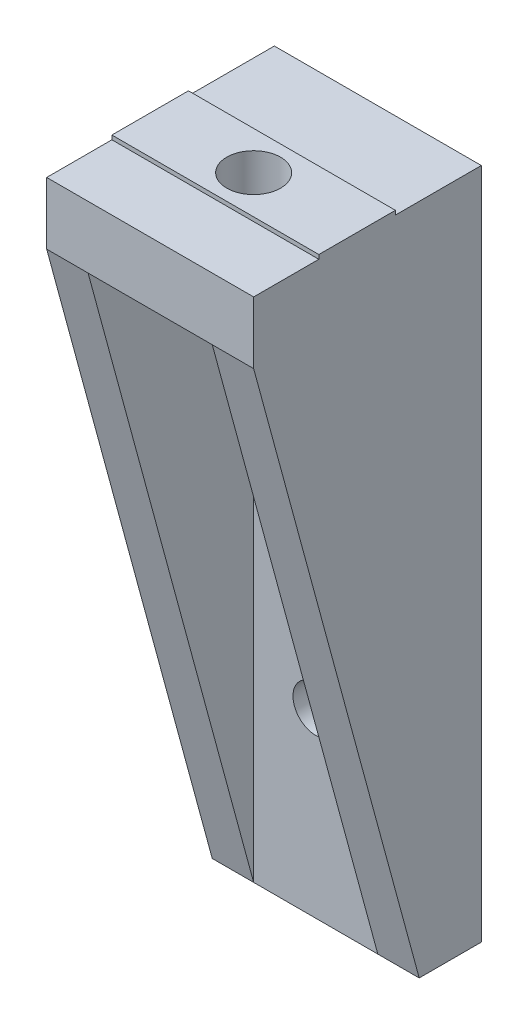
ISO-10303-21;
HEADER;
FILE_DESCRIPTION(('STEP AP214'),'2;1');
FILE_NAME('part.step','',(''),(''),'','','');
FILE_SCHEMA(('AUTOMOTIVE_DESIGN { 1 0 10303 214 1 1 1 1 }'));
ENDSEC;
DATA;
#1=APPLICATION_CONTEXT('core data for automotive mechanical design processes');
#2=APPLICATION_PROTOCOL_DEFINITION('international standard','automotive_design',2000,#1);
#3=PRODUCT_CONTEXT('',#1,'mechanical');
#4=PRODUCT('Part','Part','',(#3));
#5=PRODUCT_RELATED_PRODUCT_CATEGORY('part','',(#4));
#6=PRODUCT_DEFINITION_FORMATION('','',#4);
#7=PRODUCT_DEFINITION_CONTEXT('part definition',#1,'design');
#8=PRODUCT_DEFINITION('design','',#6,#7);
#9=PRODUCT_DEFINITION_SHAPE('','',#8);
#10=(LENGTH_UNIT() NAMED_UNIT(*) SI_UNIT(.MILLI.,.METRE.));
#11=(NAMED_UNIT(*) PLANE_ANGLE_UNIT() SI_UNIT($,.RADIAN.));
#12=(NAMED_UNIT(*) SI_UNIT($,.STERADIAN.) SOLID_ANGLE_UNIT());
#13=UNCERTAINTY_MEASURE_WITH_UNIT(LENGTH_MEASURE(1.E-05),#10,'distance_accuracy_value','');
#14=(GEOMETRIC_REPRESENTATION_CONTEXT(3) GLOBAL_UNCERTAINTY_ASSIGNED_CONTEXT((#13)) GLOBAL_UNIT_ASSIGNED_CONTEXT((#10,
#11,#12)) REPRESENTATION_CONTEXT('',''));
#15=CARTESIAN_POINT('',(0.,0.,0.));
#16=DIRECTION('',(0.,0.,1.));
#17=DIRECTION('',(1.,0.,0.));
#18=AXIS2_PLACEMENT_3D('',#15,#16,#17);
#19=CARTESIAN_POINT('',(0.,0.,6.));
#20=DIRECTION('',(0.,0.,1.));
#21=DIRECTION('',(1.,0.,0.));
#22=AXIS2_PLACEMENT_3D('',#19,#20,#21);
#23=PLANE('',#22);
#24=CARTESIAN_POINT('',(0.,17.5,6.));
#25=DIRECTION('',(0.,0.,-1.));
#26=DIRECTION('',(-1.,0.,0.));
#27=AXIS2_PLACEMENT_3D('',#24,#25,#26);
#28=CIRCLE('',#27,2.2);
#29=CARTESIAN_POINT('',(-2.2,17.5,6.));
#30=VERTEX_POINT('',#29);
#31=EDGE_CURVE('E168',#30,#30,#28,.T.);
#32=ORIENTED_EDGE('',*,*,#31,.T.);
#33=EDGE_LOOP('',(#32));
#34=FACE_BOUND('',#33,.T.);
#35=DIRECTION('',(1.,0.,0.));
#36=VECTOR('',#35,1.);
#37=CARTESIAN_POINT('',(10.,0.,6.));
#38=LINE('',#37,#36);
#39=CARTESIAN_POINT('',(-6.,0.,6.));
#40=VERTEX_POINT('',#39);
#41=CARTESIAN_POINT('',(6.,0.,6.));
#42=VERTEX_POINT('',#41);
#43=EDGE_CURVE('E151',#40,#42,#38,.T.);
#44=ORIENTED_EDGE('',*,*,#43,.T.);
#45=DIRECTION('',(0.,-1.,0.));
#46=VECTOR('',#45,1.);
#47=CARTESIAN_POINT('',(6.00000000000003,59.,6.));
#48=LINE('',#47,#46);
#49=CARTESIAN_POINT('',(6.00000000000003,59.,6.));
#50=VERTEX_POINT('',#49);
#51=EDGE_CURVE('E126',#50,#42,#48,.T.);
#52=ORIENTED_EDGE('',*,*,#51,.F.);
#53=DIRECTION('',(-1.,0.,0.));
#54=VECTOR('',#53,1.);
#55=CARTESIAN_POINT('',(10.,59.,6.));
#56=LINE('',#55,#54);
#57=CARTESIAN_POINT('',(-6.00000000000003,59.,6.));
#58=VERTEX_POINT('',#57);
#59=EDGE_CURVE('E158',#50,#58,#56,.T.);
#60=ORIENTED_EDGE('',*,*,#59,.T.);
#61=DIRECTION('',(0.,-1.,0.));
#62=VECTOR('',#61,1.);
#63=CARTESIAN_POINT('',(-6.00000000000003,59.,6.));
#64=LINE('',#63,#62);
#65=EDGE_CURVE('E155',#58,#40,#64,.T.);
#66=ORIENTED_EDGE('',*,*,#65,.T.);
#67=EDGE_LOOP('',(#44,#52,#60,#66));
#68=FACE_BOUND('',#67,.T.);
#69=ADVANCED_FACE('F36',(#34,#68),#23,.T.);
#70=CARTESIAN_POINT('',(0.,59.,0.));
#71=DIRECTION('',(0.,1.,0.));
#72=DIRECTION('',(0.,0.,1.));
#73=AXIS2_PLACEMENT_3D('',#70,#71,#72);
#74=PLANE('',#73);
#75=CARTESIAN_POINT('',(0.,59.,12.));
#76=DIRECTION('',(0.,1.,0.));
#77=DIRECTION('',(0.,0.,1.));
#78=AXIS2_PLACEMENT_3D('',#75,#76,#77);
#79=CIRCLE('',#78,2.6);
#80=CARTESIAN_POINT('',(0.,59.,14.6));
#81=VERTEX_POINT('',#80);
#82=EDGE_CURVE('E199',#81,#81,#79,.T.);
#83=ORIENTED_EDGE('',*,*,#82,.T.);
#84=EDGE_LOOP('',(#83));
#85=FACE_BOUND('',#84,.T.);
#86=DIRECTION('',(0.,0.,-1.));
#87=VECTOR('',#86,1.);
#88=CARTESIAN_POINT('',(6.00000000000003,59.,22.));
#89=LINE('',#88,#87);
#90=CARTESIAN_POINT('',(6.00000000000003,59.,22.));
#91=VERTEX_POINT('',#90);
#92=EDGE_CURVE('E132',#91,#50,#89,.T.);
#93=ORIENTED_EDGE('',*,*,#92,.F.);
#94=DIRECTION('',(1.,0.,0.));
#95=VECTOR('',#94,1.);
#96=CARTESIAN_POINT('',(-10.,59.,22.));
#97=LINE('',#96,#95);
#98=CARTESIAN_POINT('',(-6.00000000000003,59.,22.));
#99=VERTEX_POINT('',#98);
#100=EDGE_CURVE('E220',#99,#91,#97,.T.);
#101=ORIENTED_EDGE('',*,*,#100,.F.);
#102=DIRECTION('',(0.,0.,-1.));
#103=VECTOR('',#102,1.);
#104=CARTESIAN_POINT('',(-6.00000000000003,59.,22.));
#105=LINE('',#104,#103);
#106=EDGE_CURVE('E191',#99,#58,#105,.T.);
#107=ORIENTED_EDGE('',*,*,#106,.T.);
#108=ORIENTED_EDGE('',*,*,#59,.F.);
#109=EDGE_LOOP('',(#93,#101,#107,#108));
#110=FACE_BOUND('',#109,.T.);
#111=ADVANCED_FACE('F264',(#85,#110),#74,.F.);
#112=CARTESIAN_POINT('',(0.,65.,0.));
#113=DIRECTION('',(0.,1.,0.));
#114=DIRECTION('',(0.,0.,1.));
#115=AXIS2_PLACEMENT_3D('',#112,#113,#114);
#116=PLANE('',#115);
#117=DIRECTION('',(0.,0.,1.));
#118=VECTOR('',#117,1.);
#119=CARTESIAN_POINT('',(-10.,65.,0.));
#120=LINE('',#119,#118);
#121=CARTESIAN_POINT('',(-10.,65.,0.));
#122=VERTEX_POINT('',#121);
#123=CARTESIAN_POINT('',(-10.,65.,8.29999999999999));
#124=VERTEX_POINT('',#123);
#125=EDGE_CURVE('E226',#122,#124,#120,.T.);
#126=ORIENTED_EDGE('',*,*,#125,.T.);
#127=DIRECTION('',(1.,0.,0.));
#128=VECTOR('',#127,1.);
#129=CARTESIAN_POINT('',(-10.,65.,8.29999999999999));
#130=LINE('',#129,#128);
#131=CARTESIAN_POINT('',(10.,65.,8.29999999999999));
#132=VERTEX_POINT('',#131);
#133=EDGE_CURVE('E202',#124,#132,#130,.T.);
#134=ORIENTED_EDGE('',*,*,#133,.T.);
#135=DIRECTION('',(0.,0.,-1.));
#136=VECTOR('',#135,1.);
#137=CARTESIAN_POINT('',(9.99999999999999,65.,0.));
#138=LINE('',#137,#136);
#139=CARTESIAN_POINT('',(9.99999999999999,65.,0.));
#140=VERTEX_POINT('',#139);
#141=EDGE_CURVE('E232',#132,#140,#138,.T.);
#142=ORIENTED_EDGE('',*,*,#141,.T.);
#143=DIRECTION('',(-1.,0.,0.));
#144=VECTOR('',#143,1.);
#145=CARTESIAN_POINT('',(-10.,65.,0.));
#146=LINE('',#145,#144);
#147=EDGE_CURVE('E175',#140,#122,#146,.T.);
#148=ORIENTED_EDGE('',*,*,#147,.T.);
#149=EDGE_LOOP('',(#126,#134,#142,#148));
#150=FACE_BOUND('',#149,.T.);
#151=ADVANCED_FACE('F268',(#150),#116,.T.);
#152=CARTESIAN_POINT('',(10.,65.,22.));
#153=VERTEX_POINT('',#152);
#154=CARTESIAN_POINT('',(10.,65.,15.7));
#155=VERTEX_POINT('',#154);
#156=EDGE_CURVE('E233',#153,#155,#138,.T.);
#157=ORIENTED_EDGE('',*,*,#156,.T.);
#158=DIRECTION('',(-1.,0.,0.));
#159=VECTOR('',#158,1.);
#160=CARTESIAN_POINT('',(-10.,65.,15.7));
#161=LINE('',#160,#159);
#162=CARTESIAN_POINT('',(-10.,65.,15.7));
#163=VERTEX_POINT('',#162);
#164=EDGE_CURVE('E207',#155,#163,#161,.T.);
#165=ORIENTED_EDGE('',*,*,#164,.T.);
#166=CARTESIAN_POINT('',(-10.,65.,22.));
#167=VERTEX_POINT('',#166);
#168=EDGE_CURVE('E230',#163,#167,#120,.T.);
#169=ORIENTED_EDGE('',*,*,#168,.T.);
#170=DIRECTION('',(1.,0.,0.));
#171=VECTOR('',#170,1.);
#172=CARTESIAN_POINT('',(-10.,65.,22.));
#173=LINE('',#172,#171);
#174=EDGE_CURVE('E229',#167,#153,#173,.T.);
#175=ORIENTED_EDGE('',*,*,#174,.T.);
#176=EDGE_LOOP('',(#157,#165,#169,#175));
#177=FACE_BOUND('',#176,.T.);
#178=ADVANCED_FACE('F278',(#177),#116,.T.);
#179=CARTESIAN_POINT('',(10.,0.,6.));
#180=DIRECTION('',(0.,1.,0.));
#181=DIRECTION('',(-1.,0.,0.));
#182=AXIS2_PLACEMENT_3D('',#179,#180,#181);
#183=PLANE('',#182);
#184=DIRECTION('',(1.,0.,0.));
#185=VECTOR('',#184,1.);
#186=CARTESIAN_POINT('',(10.,0.,0.));
#187=LINE('',#186,#185);
#188=CARTESIAN_POINT('',(-10.,0.,0.));
#189=VERTEX_POINT('',#188);
#190=CARTESIAN_POINT('',(10.,0.,0.));
#191=VERTEX_POINT('',#190);
#192=EDGE_CURVE('E166',#189,#191,#187,.T.);
#193=ORIENTED_EDGE('',*,*,#192,.T.);
#194=DIRECTION('',(0.,0.,-1.));
#195=VECTOR('',#194,1.);
#196=CARTESIAN_POINT('',(10.,0.,6.));
#197=LINE('',#196,#195);
#198=CARTESIAN_POINT('',(10.,0.,6.));
#199=VERTEX_POINT('',#198);
#200=EDGE_CURVE('E11',#199,#191,#197,.T.);
#201=ORIENTED_EDGE('',*,*,#200,.F.);
#202=DIRECTION('',(1.,0.,0.));
#203=VECTOR('',#202,1.);
#204=CARTESIAN_POINT('',(6.,0.,6.));
#205=LINE('',#204,#203);
#206=EDGE_CURVE('E140',#42,#199,#205,.T.);
#207=ORIENTED_EDGE('',*,*,#206,.F.);
#208=ORIENTED_EDGE('',*,*,#43,.F.);
#209=CARTESIAN_POINT('',(-10.,0.,6.));
#210=VERTEX_POINT('',#209);
#211=EDGE_CURVE('E156',#210,#40,#38,.T.);
#212=ORIENTED_EDGE('',*,*,#211,.F.);
#213=DIRECTION('',(0.,0.,-1.));
#214=VECTOR('',#213,1.);
#215=CARTESIAN_POINT('',(-10.,0.,6.));
#216=LINE('',#215,#214);
#217=EDGE_CURVE('E44',#210,#189,#216,.T.);
#218=ORIENTED_EDGE('',*,*,#217,.T.);
#219=EDGE_LOOP('',(#193,#201,#207,#208,#212,#218));
#220=FACE_BOUND('',#219,.T.);
#221=ADVANCED_FACE('F38',(#220),#183,.F.);
#222=CARTESIAN_POINT('',(10.,0.,6.));
#223=DIRECTION('',(-1.,0.,0.));
#224=DIRECTION('',(0.,-1.,0.));
#225=AXIS2_PLACEMENT_3D('',#222,#223,#224);
#226=PLANE('',#225);
#227=DIRECTION('',(0.,1.,0.));
#228=VECTOR('',#227,1.);
#229=CARTESIAN_POINT('',(10.,0.,0.));
#230=LINE('',#229,#228);
#231=EDGE_CURVE('E159',#191,#140,#230,.T.);
#232=ORIENTED_EDGE('',*,*,#231,.T.);
#233=ORIENTED_EDGE('',*,*,#141,.F.);
#234=DIRECTION('',(0.,-1.,0.));
#235=VECTOR('',#234,1.);
#236=CARTESIAN_POINT('',(10.,65.4,8.29999999999999));
#237=LINE('',#236,#235);
#238=CARTESIAN_POINT('',(10.,65.4,8.29999999999999));
#239=VERTEX_POINT('',#238);
#240=EDGE_CURVE('E223',#239,#132,#237,.T.);
#241=ORIENTED_EDGE('',*,*,#240,.F.);
#242=DIRECTION('',(0.,0.,1.));
#243=VECTOR('',#242,1.);
#244=CARTESIAN_POINT('',(10.,65.4,15.7));
#245=LINE('',#244,#243);
#246=CARTESIAN_POINT('',(10.,65.4,15.7));
#247=VERTEX_POINT('',#246);
#248=EDGE_CURVE('E210',#239,#247,#245,.T.);
#249=ORIENTED_EDGE('',*,*,#248,.T.);
#250=DIRECTION('',(0.,-1.,0.));
#251=VECTOR('',#250,1.);
#252=CARTESIAN_POINT('',(10.,65.4,15.7));
#253=LINE('',#252,#251);
#254=EDGE_CURVE('E221',#247,#155,#253,.T.);
#255=ORIENTED_EDGE('',*,*,#254,.T.);
#256=ORIENTED_EDGE('',*,*,#156,.F.);
#257=DIRECTION('',(0.,-1.,0.));
#258=VECTOR('',#257,1.);
#259=CARTESIAN_POINT('',(10.,65.,22.));
#260=LINE('',#259,#258);
#261=CARTESIAN_POINT('',(10.,59.,22.));
#262=VERTEX_POINT('',#261);
#263=EDGE_CURVE('E182',#153,#262,#260,.T.);
#264=ORIENTED_EDGE('',*,*,#263,.T.);
#265=DIRECTION('',(0.,0.965140327769973,0.261732970242705));
#266=VECTOR('',#265,1.);
#267=CARTESIAN_POINT('',(10.,0.,6.));
#268=LINE('',#267,#266);
#269=EDGE_CURVE('E144',#199,#262,#268,.T.);
#270=ORIENTED_EDGE('',*,*,#269,.F.);
#271=ORIENTED_EDGE('',*,*,#200,.T.);
#272=EDGE_LOOP('',(#232,#233,#241,#249,#255,#256,#264,#270,#271));
#273=FACE_BOUND('',#272,.T.);
#274=ADVANCED_FACE('F178',(#273),#226,.F.);
#275=CARTESIAN_POINT('',(-10.,59.,6.));
#276=DIRECTION('',(1.,0.,0.));
#277=DIRECTION('',(0.,1.,0.));
#278=AXIS2_PLACEMENT_3D('',#275,#276,#277);
#279=PLANE('',#278);
#280=ORIENTED_EDGE('',*,*,#217,.F.);
#281=DIRECTION('',(0.,0.965140327769973,0.261732970242705));
#282=VECTOR('',#281,1.);
#283=CARTESIAN_POINT('',(-10.,0.,6.));
#284=LINE('',#283,#282);
#285=CARTESIAN_POINT('',(-10.,59.,22.));
#286=VERTEX_POINT('',#285);
#287=EDGE_CURVE('E186',#210,#286,#284,.T.);
#288=ORIENTED_EDGE('',*,*,#287,.T.);
#289=DIRECTION('',(0.,-1.,0.));
#290=VECTOR('',#289,1.);
#291=CARTESIAN_POINT('',(-10.,65.,22.));
#292=LINE('',#291,#290);
#293=EDGE_CURVE('E241',#167,#286,#292,.T.);
#294=ORIENTED_EDGE('',*,*,#293,.F.);
#295=ORIENTED_EDGE('',*,*,#168,.F.);
#296=DIRECTION('',(0.,-1.,0.));
#297=VECTOR('',#296,1.);
#298=CARTESIAN_POINT('',(-10.,65.4,15.7));
#299=LINE('',#298,#297);
#300=CARTESIAN_POINT('',(-10.,65.4,15.7));
#301=VERTEX_POINT('',#300);
#302=EDGE_CURVE('E51',#301,#163,#299,.T.);
#303=ORIENTED_EDGE('',*,*,#302,.F.);
#304=DIRECTION('',(0.,0.,-1.));
#305=VECTOR('',#304,1.);
#306=CARTESIAN_POINT('',(-10.,65.4,15.7));
#307=LINE('',#306,#305);
#308=CARTESIAN_POINT('',(-10.,65.4,8.29999999999999));
#309=VERTEX_POINT('',#308);
#310=EDGE_CURVE('E203',#301,#309,#307,.T.);
#311=ORIENTED_EDGE('',*,*,#310,.T.);
#312=DIRECTION('',(0.,-1.,0.));
#313=VECTOR('',#312,1.);
#314=CARTESIAN_POINT('',(-10.,65.4,8.29999999999999));
#315=LINE('',#314,#313);
#316=EDGE_CURVE('E215',#309,#124,#315,.T.);
#317=ORIENTED_EDGE('',*,*,#316,.T.);
#318=ORIENTED_EDGE('',*,*,#125,.F.);
#319=DIRECTION('',(0.,-1.,0.));
#320=VECTOR('',#319,1.);
#321=CARTESIAN_POINT('',(-10.,59.,0.));
#322=LINE('',#321,#320);
#323=EDGE_CURVE('E59',#122,#189,#322,.T.);
#324=ORIENTED_EDGE('',*,*,#323,.T.);
#325=EDGE_LOOP('',(#280,#288,#294,#295,#303,#311,#317,#318,#324));
#326=FACE_BOUND('',#325,.T.);
#327=ADVANCED_FACE('F252',(#326),#279,.F.);
#328=CARTESIAN_POINT('',(0.,0.,0.));
#329=DIRECTION('',(0.,0.,1.));
#330=DIRECTION('',(1.,0.,0.));
#331=AXIS2_PLACEMENT_3D('',#328,#329,#330);
#332=PLANE('',#331);
#333=CARTESIAN_POINT('',(0.,17.5,0.));
#334=DIRECTION('',(0.,0.,-1.));
#335=DIRECTION('',(-1.,0.,0.));
#336=AXIS2_PLACEMENT_3D('',#333,#334,#335);
#337=CIRCLE('',#336,2.2);
#338=CARTESIAN_POINT('',(-2.2,17.5,0.));
#339=VERTEX_POINT('',#338);
#340=EDGE_CURVE('E163',#339,#339,#337,.T.);
#341=ORIENTED_EDGE('',*,*,#340,.F.);
#342=EDGE_LOOP('',(#341));
#343=FACE_BOUND('',#342,.T.);
#344=ORIENTED_EDGE('',*,*,#192,.F.);
#345=ORIENTED_EDGE('',*,*,#323,.F.);
#346=ORIENTED_EDGE('',*,*,#147,.F.);
#347=ORIENTED_EDGE('',*,*,#231,.F.);
#348=EDGE_LOOP('',(#344,#345,#346,#347));
#349=FACE_BOUND('',#348,.T.);
#350=ADVANCED_FACE('F172',(#343,#349),#332,.F.);
#351=CARTESIAN_POINT('',(0.,17.5,6.));
#352=DIRECTION('',(0.,0.,-1.));
#353=DIRECTION('',(-1.,0.,0.));
#354=AXIS2_PLACEMENT_3D('',#351,#352,#353);
#355=CYLINDRICAL_SURFACE('',#354,2.2);
#356=CARTESIAN_POINT('',(-2.2,17.5,6.));
#357=CARTESIAN_POINT('',(-2.2,17.5,5.9375));
#358=CARTESIAN_POINT('',(-2.2,17.5,5.875));
#359=CARTESIAN_POINT('',(-2.2,17.5,5.75));
#360=CARTESIAN_POINT('',(-2.2,17.5,5.6875));
#361=CARTESIAN_POINT('',(-2.2,17.5,5.5625));
#362=CARTESIAN_POINT('',(-2.2,17.5,5.5));
#363=CARTESIAN_POINT('',(-2.2,17.5,5.375));
#364=CARTESIAN_POINT('',(-2.2,17.5,5.3125));
#365=CARTESIAN_POINT('',(-2.2,17.5,5.1875));
#366=CARTESIAN_POINT('',(-2.2,17.5,5.125));
#367=CARTESIAN_POINT('',(-2.2,17.5,5.));
#368=CARTESIAN_POINT('',(-2.2,17.5,4.9375));
#369=CARTESIAN_POINT('',(-2.2,17.5,4.8125));
#370=CARTESIAN_POINT('',(-2.2,17.5,4.75));
#371=CARTESIAN_POINT('',(-2.2,17.5,4.625));
#372=CARTESIAN_POINT('',(-2.2,17.5,4.5625));
#373=CARTESIAN_POINT('',(-2.2,17.5,4.4375));
#374=CARTESIAN_POINT('',(-2.2,17.5,4.375));
#375=CARTESIAN_POINT('',(-2.2,17.5,4.25));
#376=CARTESIAN_POINT('',(-2.2,17.5,4.1875));
#377=CARTESIAN_POINT('',(-2.2,17.5,4.0625));
#378=CARTESIAN_POINT('',(-2.2,17.5,4.));
#379=CARTESIAN_POINT('',(-2.2,17.5,3.875));
#380=CARTESIAN_POINT('',(-2.2,17.5,3.8125));
#381=CARTESIAN_POINT('',(-2.2,17.5,3.6875));
#382=CARTESIAN_POINT('',(-2.2,17.5,3.625));
#383=CARTESIAN_POINT('',(-2.2,17.5,3.5));
#384=CARTESIAN_POINT('',(-2.2,17.5,3.4375));
#385=CARTESIAN_POINT('',(-2.2,17.5,3.3125));
#386=CARTESIAN_POINT('',(-2.2,17.5,3.25));
#387=CARTESIAN_POINT('',(-2.2,17.5,3.125));
#388=CARTESIAN_POINT('',(-2.2,17.5,3.0625));
#389=CARTESIAN_POINT('',(-2.2,17.5,2.9375));
#390=CARTESIAN_POINT('',(-2.2,17.5,2.875));
#391=CARTESIAN_POINT('',(-2.2,17.5,2.75));
#392=CARTESIAN_POINT('',(-2.2,17.5,2.6875));
#393=CARTESIAN_POINT('',(-2.2,17.5,2.5625));
#394=CARTESIAN_POINT('',(-2.2,17.5,2.5));
#395=CARTESIAN_POINT('',(-2.2,17.5,2.375));
#396=CARTESIAN_POINT('',(-2.2,17.5,2.3125));
#397=CARTESIAN_POINT('',(-2.2,17.5,2.1875));
#398=CARTESIAN_POINT('',(-2.2,17.5,2.125));
#399=CARTESIAN_POINT('',(-2.2,17.5,2.));
#400=CARTESIAN_POINT('',(-2.2,17.5,1.9375));
#401=CARTESIAN_POINT('',(-2.2,17.5,1.8125));
#402=CARTESIAN_POINT('',(-2.2,17.5,1.75));
#403=CARTESIAN_POINT('',(-2.2,17.5,1.625));
#404=CARTESIAN_POINT('',(-2.2,17.5,1.5625));
#405=CARTESIAN_POINT('',(-2.2,17.5,1.4375));
#406=CARTESIAN_POINT('',(-2.2,17.5,1.375));
#407=CARTESIAN_POINT('',(-2.2,17.5,1.25));
#408=CARTESIAN_POINT('',(-2.2,17.5,1.1875));
#409=CARTESIAN_POINT('',(-2.2,17.5,1.0625));
#410=CARTESIAN_POINT('',(-2.2,17.5,1.));
#411=CARTESIAN_POINT('',(-2.2,17.5,0.875));
#412=CARTESIAN_POINT('',(-2.2,17.5,0.8125));
#413=CARTESIAN_POINT('',(-2.2,17.5,0.687500000000001));
#414=CARTESIAN_POINT('',(-2.2,17.5,0.625000000000001));
#415=CARTESIAN_POINT('',(-2.2,17.5,0.5));
#416=CARTESIAN_POINT('',(-2.2,17.5,0.4375));
#417=CARTESIAN_POINT('',(-2.2,17.5,0.3125));
#418=CARTESIAN_POINT('',(-2.2,17.5,0.25));
#419=CARTESIAN_POINT('',(-2.2,17.5,0.125));
#420=CARTESIAN_POINT('',(-2.2,17.5,0.0625000000000001));
#421=CARTESIAN_POINT('',(-2.2,17.5,0.));
#422=B_SPLINE_CURVE_WITH_KNOTS('',3,(#356,#357,#358,#359,#360,#361,#362,#363,#364,#365,#366,
#367,#368,#369,#370,#371,#372,#373,#374,#375,#376,#377,#378,#379,#380,#381,#382,#383,#384,#385,
#386,#387,#388,#389,#390,#391,#392,#393,#394,#395,#396,#397,#398,#399,#400,#401,#402,#403,#404,
#405,#406,#407,#408,#409,#410,#411,#412,#413,#414,#415,#416,#417,#418,#419,#420,#421),
.UNSPECIFIED.,.F.,.F.,(4,2,2,2,2,2,2,2,2,2,2,2,2,2,2,2,2,2,2,2,2,2,2,2,2,2,2,2,2,2,2,2,4),(0.,
0.1875,0.375,0.5625,0.750000000000001,0.937500000000001,1.125,1.3125,1.5,1.6875,1.875,2.0625,
2.25,2.4375,2.625,2.8125,3.,3.1875,3.375,3.5625,3.75,3.9375,4.125,4.3125,4.5,4.6875,4.875,
5.0625,5.25,5.4375,5.625,5.8125,6.),.UNSPECIFIED.);
#423=EDGE_CURVE('BSEAM249',#30,#339,#422,.T.);
#424=ORIENTED_EDGE('',*,*,#31,.F.);
#425=ORIENTED_EDGE('',*,*,#340,.T.);
#426=ORIENTED_EDGE('',*,*,#423,.T.);
#427=ORIENTED_EDGE('',*,*,#423,.F.);
#428=EDGE_LOOP('',(#424,#426,#425,#427));
#429=FACE_BOUND('',#428,.T.);
#430=ADVANCED_FACE('F249',(#429),#355,.F.);
#431=CARTESIAN_POINT('',(-10.,65.,22.));
#432=DIRECTION('',(0.,0.,-1.));
#433=DIRECTION('',(-1.,0.,0.));
#434=AXIS2_PLACEMENT_3D('',#431,#432,#433);
#435=PLANE('',#434);
#436=EDGE_CURVE('E237',#286,#99,#97,.T.);
#437=ORIENTED_EDGE('',*,*,#436,.T.);
#438=ORIENTED_EDGE('',*,*,#100,.T.);
#439=DIRECTION('',(1.,0.,0.));
#440=VECTOR('',#439,1.);
#441=CARTESIAN_POINT('',(6.00000000000003,59.,22.));
#442=LINE('',#441,#440);
#443=EDGE_CURVE('E143',#91,#262,#442,.T.);
#444=ORIENTED_EDGE('',*,*,#443,.T.);
#445=ORIENTED_EDGE('',*,*,#263,.F.);
#446=ORIENTED_EDGE('',*,*,#174,.F.);
#447=ORIENTED_EDGE('',*,*,#293,.T.);
#448=EDGE_LOOP('',(#437,#438,#444,#445,#446,#447));
#449=FACE_BOUND('',#448,.T.);
#450=ADVANCED_FACE('F258',(#449),#435,.F.);
#451=CARTESIAN_POINT('',(-10.,65.4,15.7));
#452=DIRECTION('',(0.,0.,1.));
#453=DIRECTION('',(1.,0.,0.));
#454=AXIS2_PLACEMENT_3D('',#451,#452,#453);
#455=PLANE('',#454);
#456=ORIENTED_EDGE('',*,*,#164,.F.);
#457=ORIENTED_EDGE('',*,*,#254,.F.);
#458=DIRECTION('',(-1.,0.,0.));
#459=VECTOR('',#458,1.);
#460=CARTESIAN_POINT('',(-10.,65.4,15.7));
#461=LINE('',#460,#459);
#462=EDGE_CURVE('E213',#247,#301,#461,.T.);
#463=ORIENTED_EDGE('',*,*,#462,.T.);
#464=ORIENTED_EDGE('',*,*,#302,.T.);
#465=EDGE_LOOP('',(#456,#457,#463,#464));
#466=FACE_BOUND('',#465,.T.);
#467=ADVANCED_FACE('F273',(#466),#455,.T.);
#468=CARTESIAN_POINT('',(-10.,65.4,8.29999999999999));
#469=DIRECTION('',(0.,0.,-1.));
#470=DIRECTION('',(-1.,0.,0.));
#471=AXIS2_PLACEMENT_3D('',#468,#469,#470);
#472=PLANE('',#471);
#473=ORIENTED_EDGE('',*,*,#133,.F.);
#474=ORIENTED_EDGE('',*,*,#316,.F.);
#475=DIRECTION('',(1.,0.,0.));
#476=VECTOR('',#475,1.);
#477=CARTESIAN_POINT('',(-10.,65.4,8.29999999999999));
#478=LINE('',#477,#476);
#479=EDGE_CURVE('E206',#309,#239,#478,.T.);
#480=ORIENTED_EDGE('',*,*,#479,.T.);
#481=ORIENTED_EDGE('',*,*,#240,.T.);
#482=EDGE_LOOP('',(#473,#474,#480,#481));
#483=FACE_BOUND('',#482,.T.);
#484=ADVANCED_FACE('F280',(#483),#472,.T.);
#485=CARTESIAN_POINT('',(0.,65.4,0.));
#486=DIRECTION('',(0.,-1.,0.));
#487=DIRECTION('',(0.,0.,-1.));
#488=AXIS2_PLACEMENT_3D('',#485,#486,#487);
#489=PLANE('',#488);
#490=CARTESIAN_POINT('',(0.,65.4,12.));
#491=DIRECTION('',(0.,1.,0.));
#492=DIRECTION('',(0.,0.,1.));
#493=AXIS2_PLACEMENT_3D('',#490,#491,#492);
#494=CIRCLE('',#493,2.6);
#495=CARTESIAN_POINT('',(0.,65.4,14.6));
#496=VERTEX_POINT('',#495);
#497=EDGE_CURVE('E195',#496,#496,#494,.T.);
#498=ORIENTED_EDGE('',*,*,#497,.F.);
#499=EDGE_LOOP('',(#498));
#500=FACE_BOUND('',#499,.T.);
#501=ORIENTED_EDGE('',*,*,#310,.F.);
#502=ORIENTED_EDGE('',*,*,#462,.F.);
#503=ORIENTED_EDGE('',*,*,#248,.F.);
#504=ORIENTED_EDGE('',*,*,#479,.F.);
#505=EDGE_LOOP('',(#501,#502,#503,#504));
#506=FACE_BOUND('',#505,.T.);
#507=ADVANCED_FACE('F283',(#500,#506),#489,.F.);
#508=CARTESIAN_POINT('',(0.,0.,12.));
#509=DIRECTION('',(0.,1.,0.));
#510=DIRECTION('',(0.,0.,1.));
#511=AXIS2_PLACEMENT_3D('',#508,#509,#510);
#512=CYLINDRICAL_SURFACE('',#511,2.6);
#513=ORIENTED_EDGE('',*,*,#497,.T.);
#514=EDGE_LOOP('',(#513));
#515=FACE_BOUND('',#514,.T.);
#516=ORIENTED_EDGE('',*,*,#82,.F.);
#517=EDGE_LOOP('',(#516));
#518=FACE_BOUND('',#517,.T.);
#519=ADVANCED_FACE('F289',(#515,#518),#512,.F.);
#520=CARTESIAN_POINT('',(-6.,0.,6.));
#521=DIRECTION('',(0.,-0.261732970242705,0.965140327769973));
#522=DIRECTION('',(0.,-0.965140327769973,-0.261732970242705));
#523=AXIS2_PLACEMENT_3D('',#520,#521,#522);
#524=PLANE('',#523);
#525=ORIENTED_EDGE('',*,*,#287,.F.);
#526=ORIENTED_EDGE('',*,*,#211,.T.);
#527=DIRECTION('',(0.,0.965140327769973,0.261732970242705));
#528=VECTOR('',#527,1.);
#529=CARTESIAN_POINT('',(-6.,0.,6.));
#530=LINE('',#529,#528);
#531=EDGE_CURVE('E188',#40,#99,#530,.T.);
#532=ORIENTED_EDGE('',*,*,#531,.T.);
#533=ORIENTED_EDGE('',*,*,#436,.F.);
#534=EDGE_LOOP('',(#525,#526,#532,#533));
#535=FACE_BOUND('',#534,.T.);
#536=ADVANCED_FACE('F293',(#535),#524,.T.);
#537=CARTESIAN_POINT('',(-6.,0.,0.));
#538=DIRECTION('',(-1.,0.,0.));
#539=DIRECTION('',(0.,-1.,0.));
#540=AXIS2_PLACEMENT_3D('',#537,#538,#539);
#541=PLANE('',#540);
#542=ORIENTED_EDGE('',*,*,#531,.F.);
#543=ORIENTED_EDGE('',*,*,#65,.F.);
#544=ORIENTED_EDGE('',*,*,#106,.F.);
#545=EDGE_LOOP('',(#542,#543,#544));
#546=FACE_BOUND('',#545,.T.);
#547=ADVANCED_FACE('F297',(#546),#541,.F.);
#548=CARTESIAN_POINT('',(6.,0.,6.));
#549=DIRECTION('',(0.,0.261732970242705,-0.965140327769973));
#550=DIRECTION('',(0.,0.965140327769973,0.261732970242705));
#551=AXIS2_PLACEMENT_3D('',#548,#549,#550);
#552=PLANE('',#551);
#553=ORIENTED_EDGE('',*,*,#269,.T.);
#554=ORIENTED_EDGE('',*,*,#443,.F.);
#555=DIRECTION('',(0.,0.965140327769973,0.261732970242705));
#556=VECTOR('',#555,1.);
#557=CARTESIAN_POINT('',(6.,0.,6.));
#558=LINE('',#557,#556);
#559=EDGE_CURVE('E129',#42,#91,#558,.T.);
#560=ORIENTED_EDGE('',*,*,#559,.F.);
#561=ORIENTED_EDGE('',*,*,#206,.T.);
#562=EDGE_LOOP('',(#553,#554,#560,#561));
#563=FACE_BOUND('',#562,.T.);
#564=ADVANCED_FACE('F139',(#563),#552,.F.);
#565=CARTESIAN_POINT('',(6.,0.,0.));
#566=DIRECTION('',(1.,0.,0.));
#567=DIRECTION('',(0.,-1.,0.));
#568=AXIS2_PLACEMENT_3D('',#565,#566,#567);
#569=PLANE('',#568);
#570=ORIENTED_EDGE('',*,*,#559,.T.);
#571=ORIENTED_EDGE('',*,*,#92,.T.);
#572=ORIENTED_EDGE('',*,*,#51,.T.);
#573=EDGE_LOOP('',(#570,#571,#572));
#574=FACE_BOUND('',#573,.T.);
#575=ADVANCED_FACE('F128',(#574),#569,.F.);
#576=CLOSED_SHELL('',(#69,#111,#151,#178,#221,#274,#327,#350,#430,#450,#467,#484,#507,#519,#536,
#547,#564,#575));
#577=MANIFOLD_SOLID_BREP('B2',#576);
#578=ADVANCED_BREP_SHAPE_REPRESENTATION('',(#18,#577),#14);
#579=SHAPE_DEFINITION_REPRESENTATION(#9,#578);
ENDSEC;
END-ISO-10303-21;
